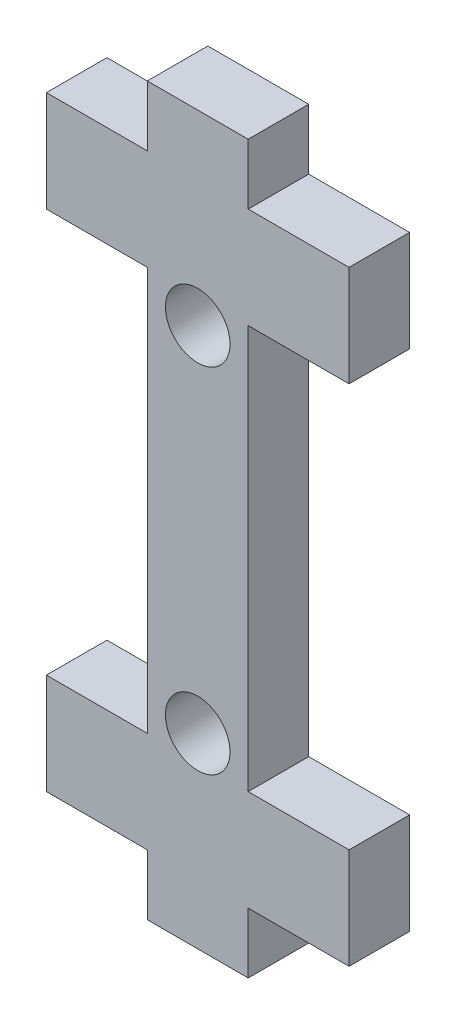
ISO-10303-21;
HEADER;
FILE_DESCRIPTION(('STEP AP214'),'2;1');
FILE_NAME('part.step','',(''),(''),'','','');
FILE_SCHEMA(('AUTOMOTIVE_DESIGN { 1 0 10303 214 1 1 1 1 }'));
ENDSEC;
DATA;
#1=APPLICATION_CONTEXT('core data for automotive mechanical design processes');
#2=APPLICATION_PROTOCOL_DEFINITION('international standard','automotive_design',2000,#1);
#3=PRODUCT_CONTEXT('',#1,'mechanical');
#4=PRODUCT('Part','Part','',(#3));
#5=PRODUCT_RELATED_PRODUCT_CATEGORY('part','',(#4));
#6=PRODUCT_DEFINITION_FORMATION('','',#4);
#7=PRODUCT_DEFINITION_CONTEXT('part definition',#1,'design');
#8=PRODUCT_DEFINITION('design','',#6,#7);
#9=PRODUCT_DEFINITION_SHAPE('','',#8);
#10=(LENGTH_UNIT() NAMED_UNIT(*) SI_UNIT(.MILLI.,.METRE.));
#11=(NAMED_UNIT(*) PLANE_ANGLE_UNIT() SI_UNIT($,.RADIAN.));
#12=(NAMED_UNIT(*) SI_UNIT($,.STERADIAN.) SOLID_ANGLE_UNIT());
#13=UNCERTAINTY_MEASURE_WITH_UNIT(LENGTH_MEASURE(1.E-05),#10,'distance_accuracy_value','');
#14=(GEOMETRIC_REPRESENTATION_CONTEXT(3) GLOBAL_UNCERTAINTY_ASSIGNED_CONTEXT((#13)) GLOBAL_UNIT_ASSIGNED_CONTEXT((#10,
#11,#12)) REPRESENTATION_CONTEXT('',''));
#15=CARTESIAN_POINT('',(0.,0.,0.));
#16=DIRECTION('',(0.,0.,1.));
#17=DIRECTION('',(1.,0.,0.));
#18=AXIS2_PLACEMENT_3D('',#15,#16,#17);
#19=CARTESIAN_POINT('',(0.,0.,3.));
#20=DIRECTION('',(0.,0.,-1.));
#21=DIRECTION('',(-1.,0.,0.));
#22=AXIS2_PLACEMENT_3D('',#19,#20,#21);
#23=PLANE('',#22);
#24=DIRECTION('',(0.,1.,0.));
#25=VECTOR('',#24,1.);
#26=CARTESIAN_POINT('',(2.5,15.,3.));
#27=LINE('',#26,#25);
#28=CARTESIAN_POINT('',(2.5,15.,3.));
#29=VERTEX_POINT('',#28);
#30=CARTESIAN_POINT('',(2.5,18.,3.));
#31=VERTEX_POINT('',#30);
#32=EDGE_CURVE('E272',#29,#31,#27,.T.);
#33=ORIENTED_EDGE('',*,*,#32,.T.);
#34=DIRECTION('',(-1.,0.,0.));
#35=VECTOR('',#34,1.);
#36=CARTESIAN_POINT('',(-2.5,18.,3.));
#37=LINE('',#36,#35);
#38=CARTESIAN_POINT('',(-2.5,18.,3.));
#39=VERTEX_POINT('',#38);
#40=EDGE_CURVE('E136',#31,#39,#37,.T.);
#41=ORIENTED_EDGE('',*,*,#40,.T.);
#42=DIRECTION('',(0.,-1.,0.));
#43=VECTOR('',#42,1.);
#44=CARTESIAN_POINT('',(-2.5,15.,3.));
#45=LINE('',#44,#43);
#46=CARTESIAN_POINT('',(-2.5,15.,3.));
#47=VERTEX_POINT('',#46);
#48=EDGE_CURVE('E341',#39,#47,#45,.T.);
#49=ORIENTED_EDGE('',*,*,#48,.T.);
#50=DIRECTION('',(-1.,0.,0.));
#51=VECTOR('',#50,1.);
#52=CARTESIAN_POINT('',(-7.5,15.,3.));
#53=LINE('',#52,#51);
#54=CARTESIAN_POINT('',(-7.5,15.,3.));
#55=VERTEX_POINT('',#54);
#56=EDGE_CURVE('E361',#47,#55,#53,.T.);
#57=ORIENTED_EDGE('',*,*,#56,.T.);
#58=DIRECTION('',(0.,-1.,0.));
#59=VECTOR('',#58,1.);
#60=CARTESIAN_POINT('',(-7.5,15.,3.));
#61=LINE('',#60,#59);
#62=CARTESIAN_POINT('',(-7.5,10.,3.));
#63=VERTEX_POINT('',#62);
#64=EDGE_CURVE('E357',#55,#63,#61,.T.);
#65=ORIENTED_EDGE('',*,*,#64,.T.);
#66=DIRECTION('',(1.,0.,0.));
#67=VECTOR('',#66,1.);
#68=CARTESIAN_POINT('',(-7.5,10.,3.));
#69=LINE('',#68,#67);
#70=CARTESIAN_POINT('',(-2.5,10.,3.));
#71=VERTEX_POINT('',#70);
#72=EDGE_CURVE('E360',#63,#71,#69,.T.);
#73=ORIENTED_EDGE('',*,*,#72,.T.);
#74=DIRECTION('',(0.,-1.,0.));
#75=VECTOR('',#74,1.);
#76=CARTESIAN_POINT('',(-2.5,-10.,3.));
#77=LINE('',#76,#75);
#78=CARTESIAN_POINT('',(-2.5,-10.,3.));
#79=VERTEX_POINT('',#78);
#80=EDGE_CURVE('E365',#71,#79,#77,.T.);
#81=ORIENTED_EDGE('',*,*,#80,.T.);
#82=DIRECTION('',(-1.,0.,0.));
#83=VECTOR('',#82,1.);
#84=CARTESIAN_POINT('',(-7.5,-10.,3.));
#85=LINE('',#84,#83);
#86=CARTESIAN_POINT('',(-7.5,-10.,3.));
#87=VERTEX_POINT('',#86);
#88=EDGE_CURVE('E372',#79,#87,#85,.T.);
#89=ORIENTED_EDGE('',*,*,#88,.T.);
#90=DIRECTION('',(0.,-1.,0.));
#91=VECTOR('',#90,1.);
#92=CARTESIAN_POINT('',(-7.5,-15.,3.));
#93=LINE('',#92,#91);
#94=CARTESIAN_POINT('',(-7.5,-15.,3.));
#95=VERTEX_POINT('',#94);
#96=EDGE_CURVE('E375',#87,#95,#93,.T.);
#97=ORIENTED_EDGE('',*,*,#96,.T.);
#98=DIRECTION('',(1.,0.,0.));
#99=VECTOR('',#98,1.);
#100=CARTESIAN_POINT('',(-7.5,-15.,3.));
#101=LINE('',#100,#99);
#102=CARTESIAN_POINT('',(-2.5,-15.,3.));
#103=VERTEX_POINT('',#102);
#104=EDGE_CURVE('E378',#95,#103,#101,.T.);
#105=ORIENTED_EDGE('',*,*,#104,.T.);
#106=DIRECTION('',(0.,-1.,0.));
#107=VECTOR('',#106,1.);
#108=CARTESIAN_POINT('',(-2.5,-18.,3.));
#109=LINE('',#108,#107);
#110=CARTESIAN_POINT('',(-2.5,-18.,3.));
#111=VERTEX_POINT('',#110);
#112=EDGE_CURVE('E381',#103,#111,#109,.T.);
#113=ORIENTED_EDGE('',*,*,#112,.T.);
#114=DIRECTION('',(1.,0.,0.));
#115=VECTOR('',#114,1.);
#116=CARTESIAN_POINT('',(-2.5,-18.,3.));
#117=LINE('',#116,#115);
#118=CARTESIAN_POINT('',(2.5,-18.,3.));
#119=VERTEX_POINT('',#118);
#120=EDGE_CURVE('E384',#111,#119,#117,.T.);
#121=ORIENTED_EDGE('',*,*,#120,.T.);
#122=DIRECTION('',(0.,1.,0.));
#123=VECTOR('',#122,1.);
#124=CARTESIAN_POINT('',(2.5,-18.,3.));
#125=LINE('',#124,#123);
#126=CARTESIAN_POINT('',(2.5,-15.,3.));
#127=VERTEX_POINT('',#126);
#128=EDGE_CURVE('E387',#119,#127,#125,.T.);
#129=ORIENTED_EDGE('',*,*,#128,.T.);
#130=DIRECTION('',(1.,0.,0.));
#131=VECTOR('',#130,1.);
#132=CARTESIAN_POINT('',(2.5,-15.,3.));
#133=LINE('',#132,#131);
#134=CARTESIAN_POINT('',(7.5,-15.,3.));
#135=VERTEX_POINT('',#134);
#136=EDGE_CURVE('E390',#127,#135,#133,.T.);
#137=ORIENTED_EDGE('',*,*,#136,.T.);
#138=DIRECTION('',(0.,1.,0.));
#139=VECTOR('',#138,1.);
#140=CARTESIAN_POINT('',(7.5,-15.,3.));
#141=LINE('',#140,#139);
#142=CARTESIAN_POINT('',(7.5,-10.,3.));
#143=VERTEX_POINT('',#142);
#144=EDGE_CURVE('E393',#135,#143,#141,.T.);
#145=ORIENTED_EDGE('',*,*,#144,.T.);
#146=DIRECTION('',(-1.,0.,0.));
#147=VECTOR('',#146,1.);
#148=CARTESIAN_POINT('',(2.5,-10.,3.));
#149=LINE('',#148,#147);
#150=CARTESIAN_POINT('',(2.5,-10.,3.));
#151=VERTEX_POINT('',#150);
#152=EDGE_CURVE('E396',#143,#151,#149,.T.);
#153=ORIENTED_EDGE('',*,*,#152,.T.);
#154=DIRECTION('',(0.,1.,0.));
#155=VECTOR('',#154,1.);
#156=CARTESIAN_POINT('',(2.5,-10.,3.));
#157=LINE('',#156,#155);
#158=CARTESIAN_POINT('',(2.5,10.,3.));
#159=VERTEX_POINT('',#158);
#160=EDGE_CURVE('E191',#151,#159,#157,.T.);
#161=ORIENTED_EDGE('',*,*,#160,.T.);
#162=DIRECTION('',(1.,0.,0.));
#163=VECTOR('',#162,1.);
#164=CARTESIAN_POINT('',(2.5,10.,3.));
#165=LINE('',#164,#163);
#166=CARTESIAN_POINT('',(7.5,10.,3.));
#167=VERTEX_POINT('',#166);
#168=EDGE_CURVE('E185',#159,#167,#165,.T.);
#169=ORIENTED_EDGE('',*,*,#168,.T.);
#170=DIRECTION('',(0.,1.,0.));
#171=VECTOR('',#170,1.);
#172=CARTESIAN_POINT('',(7.5,15.,3.));
#173=LINE('',#172,#171);
#174=CARTESIAN_POINT('',(7.5,15.,3.));
#175=VERTEX_POINT('',#174);
#176=EDGE_CURVE('E189',#167,#175,#173,.T.);
#177=ORIENTED_EDGE('',*,*,#176,.T.);
#178=DIRECTION('',(-1.,0.,0.));
#179=VECTOR('',#178,1.);
#180=CARTESIAN_POINT('',(2.5,15.,3.));
#181=LINE('',#180,#179);
#182=EDGE_CURVE('E57',#175,#29,#181,.T.);
#183=ORIENTED_EDGE('',*,*,#182,.T.);
#184=EDGE_LOOP('',(#33,#41,#49,#57,#65,#73,#81,#89,#97,#105,#113,#121,#129,#137,#145,#153,#161,
#169,#177,#183));
#185=FACE_BOUND('',#184,.T.);
#186=CARTESIAN_POINT('',(0.,8.75,3.));
#187=DIRECTION('',(0.,0.,1.));
#188=DIRECTION('',(1.,0.,0.));
#189=AXIS2_PLACEMENT_3D('',#186,#187,#188);
#190=CIRCLE('',#189,1.6);
#191=CARTESIAN_POINT('',(1.6,8.75,3.));
#192=VERTEX_POINT('',#191);
#193=EDGE_CURVE('E218',#192,#192,#190,.T.);
#194=ORIENTED_EDGE('',*,*,#193,.F.);
#195=EDGE_LOOP('',(#194));
#196=FACE_BOUND('',#195,.T.);
#197=CARTESIAN_POINT('',(0.,-8.75,3.));
#198=DIRECTION('',(0.,0.,1.));
#199=DIRECTION('',(-1.,0.,0.));
#200=AXIS2_PLACEMENT_3D('',#197,#198,#199);
#201=CIRCLE('',#200,1.6);
#202=CARTESIAN_POINT('',(-1.6,-8.75,3.));
#203=VERTEX_POINT('',#202);
#204=EDGE_CURVE('E439',#203,#203,#201,.T.);
#205=ORIENTED_EDGE('',*,*,#204,.F.);
#206=EDGE_LOOP('',(#205));
#207=FACE_BOUND('',#206,.T.);
#208=ADVANCED_FACE('F39',(#185,#196,#207),#23,.F.);
#209=CARTESIAN_POINT('',(0.,0.,0.));
#210=DIRECTION('',(0.,0.,-1.));
#211=DIRECTION('',(-1.,0.,0.));
#212=AXIS2_PLACEMENT_3D('',#209,#210,#211);
#213=PLANE('',#212);
#214=CARTESIAN_POINT('',(0.,8.75,0.));
#215=DIRECTION('',(0.,0.,1.));
#216=DIRECTION('',(1.,0.,0.));
#217=AXIS2_PLACEMENT_3D('',#214,#215,#216);
#218=CIRCLE('',#217,1.6);
#219=CARTESIAN_POINT('',(1.6,8.75,0.));
#220=VERTEX_POINT('',#219);
#221=EDGE_CURVE('E446',#220,#220,#218,.T.);
#222=ORIENTED_EDGE('',*,*,#221,.T.);
#223=EDGE_LOOP('',(#222));
#224=FACE_BOUND('',#223,.T.);
#225=DIRECTION('',(0.,1.,0.));
#226=VECTOR('',#225,1.);
#227=CARTESIAN_POINT('',(2.5,15.,0.));
#228=LINE('',#227,#226);
#229=CARTESIAN_POINT('',(2.5,15.,0.));
#230=VERTEX_POINT('',#229);
#231=CARTESIAN_POINT('',(2.5,18.,0.));
#232=VERTEX_POINT('',#231);
#233=EDGE_CURVE('E213',#230,#232,#228,.T.);
#234=ORIENTED_EDGE('',*,*,#233,.F.);
#235=DIRECTION('',(-1.,0.,0.));
#236=VECTOR('',#235,1.);
#237=CARTESIAN_POINT('',(2.5,15.,0.));
#238=LINE('',#237,#236);
#239=CARTESIAN_POINT('',(7.5,15.,0.));
#240=VERTEX_POINT('',#239);
#241=EDGE_CURVE('E128',#240,#230,#238,.T.);
#242=ORIENTED_EDGE('',*,*,#241,.F.);
#243=DIRECTION('',(0.,1.,0.));
#244=VECTOR('',#243,1.);
#245=CARTESIAN_POINT('',(7.5,15.,0.));
#246=LINE('',#245,#244);
#247=CARTESIAN_POINT('',(7.5,10.,0.));
#248=VERTEX_POINT('',#247);
#249=EDGE_CURVE('E122',#248,#240,#246,.T.);
#250=ORIENTED_EDGE('',*,*,#249,.F.);
#251=DIRECTION('',(1.,0.,0.));
#252=VECTOR('',#251,1.);
#253=CARTESIAN_POINT('',(2.5,10.,0.));
#254=LINE('',#253,#252);
#255=CARTESIAN_POINT('',(2.5,10.,0.));
#256=VERTEX_POINT('',#255);
#257=EDGE_CURVE('E200',#256,#248,#254,.T.);
#258=ORIENTED_EDGE('',*,*,#257,.F.);
#259=DIRECTION('',(0.,1.,0.));
#260=VECTOR('',#259,1.);
#261=CARTESIAN_POINT('',(2.5,-10.,0.));
#262=LINE('',#261,#260);
#263=CARTESIAN_POINT('',(2.5,-10.,0.));
#264=VERTEX_POINT('',#263);
#265=EDGE_CURVE('E263',#264,#256,#262,.T.);
#266=ORIENTED_EDGE('',*,*,#265,.F.);
#267=DIRECTION('',(-1.,0.,0.));
#268=VECTOR('',#267,1.);
#269=CARTESIAN_POINT('',(2.5,-10.,0.));
#270=LINE('',#269,#268);
#271=CARTESIAN_POINT('',(7.5,-10.,0.));
#272=VERTEX_POINT('',#271);
#273=EDGE_CURVE('E260',#272,#264,#270,.T.);
#274=ORIENTED_EDGE('',*,*,#273,.F.);
#275=DIRECTION('',(0.,1.,0.));
#276=VECTOR('',#275,1.);
#277=CARTESIAN_POINT('',(7.5,-15.,0.));
#278=LINE('',#277,#276);
#279=CARTESIAN_POINT('',(7.5,-15.,0.));
#280=VERTEX_POINT('',#279);
#281=EDGE_CURVE('E257',#280,#272,#278,.T.);
#282=ORIENTED_EDGE('',*,*,#281,.F.);
#283=DIRECTION('',(1.,0.,0.));
#284=VECTOR('',#283,1.);
#285=CARTESIAN_POINT('',(2.5,-15.,0.));
#286=LINE('',#285,#284);
#287=CARTESIAN_POINT('',(2.5,-15.,0.));
#288=VERTEX_POINT('',#287);
#289=EDGE_CURVE('E254',#288,#280,#286,.T.);
#290=ORIENTED_EDGE('',*,*,#289,.F.);
#291=DIRECTION('',(0.,1.,0.));
#292=VECTOR('',#291,1.);
#293=CARTESIAN_POINT('',(2.5,-18.,0.));
#294=LINE('',#293,#292);
#295=CARTESIAN_POINT('',(2.5,-18.,0.));
#296=VERTEX_POINT('',#295);
#297=EDGE_CURVE('E251',#296,#288,#294,.T.);
#298=ORIENTED_EDGE('',*,*,#297,.F.);
#299=DIRECTION('',(1.,0.,0.));
#300=VECTOR('',#299,1.);
#301=CARTESIAN_POINT('',(-2.5,-18.,0.));
#302=LINE('',#301,#300);
#303=CARTESIAN_POINT('',(-2.5,-18.,0.));
#304=VERTEX_POINT('',#303);
#305=EDGE_CURVE('E248',#304,#296,#302,.T.);
#306=ORIENTED_EDGE('',*,*,#305,.F.);
#307=DIRECTION('',(0.,-1.,0.));
#308=VECTOR('',#307,1.);
#309=CARTESIAN_POINT('',(-2.5,-18.,0.));
#310=LINE('',#309,#308);
#311=CARTESIAN_POINT('',(-2.5,-15.,0.));
#312=VERTEX_POINT('',#311);
#313=EDGE_CURVE('E245',#312,#304,#310,.T.);
#314=ORIENTED_EDGE('',*,*,#313,.F.);
#315=DIRECTION('',(1.,0.,0.));
#316=VECTOR('',#315,1.);
#317=CARTESIAN_POINT('',(-7.5,-15.,0.));
#318=LINE('',#317,#316);
#319=CARTESIAN_POINT('',(-7.5,-15.,0.));
#320=VERTEX_POINT('',#319);
#321=EDGE_CURVE('E242',#320,#312,#318,.T.);
#322=ORIENTED_EDGE('',*,*,#321,.F.);
#323=DIRECTION('',(0.,-1.,0.));
#324=VECTOR('',#323,1.);
#325=CARTESIAN_POINT('',(-7.5,-15.,0.));
#326=LINE('',#325,#324);
#327=CARTESIAN_POINT('',(-7.5,-10.,0.));
#328=VERTEX_POINT('',#327);
#329=EDGE_CURVE('E239',#328,#320,#326,.T.);
#330=ORIENTED_EDGE('',*,*,#329,.F.);
#331=DIRECTION('',(-1.,0.,0.));
#332=VECTOR('',#331,1.);
#333=CARTESIAN_POINT('',(-7.5,-10.,0.));
#334=LINE('',#333,#332);
#335=CARTESIAN_POINT('',(-2.5,-10.,0.));
#336=VERTEX_POINT('',#335);
#337=EDGE_CURVE('E236',#336,#328,#334,.T.);
#338=ORIENTED_EDGE('',*,*,#337,.F.);
#339=DIRECTION('',(0.,-1.,0.));
#340=VECTOR('',#339,1.);
#341=CARTESIAN_POINT('',(-2.5,-10.,0.));
#342=LINE('',#341,#340);
#343=CARTESIAN_POINT('',(-2.5,10.,0.));
#344=VERTEX_POINT('',#343);
#345=EDGE_CURVE('E233',#344,#336,#342,.T.);
#346=ORIENTED_EDGE('',*,*,#345,.F.);
#347=DIRECTION('',(1.,0.,0.));
#348=VECTOR('',#347,1.);
#349=CARTESIAN_POINT('',(-7.5,10.,0.));
#350=LINE('',#349,#348);
#351=CARTESIAN_POINT('',(-7.5,10.,0.));
#352=VERTEX_POINT('',#351);
#353=EDGE_CURVE('E230',#352,#344,#350,.T.);
#354=ORIENTED_EDGE('',*,*,#353,.F.);
#355=DIRECTION('',(0.,-1.,0.));
#356=VECTOR('',#355,1.);
#357=CARTESIAN_POINT('',(-7.5,15.,0.));
#358=LINE('',#357,#356);
#359=CARTESIAN_POINT('',(-7.5,15.,0.));
#360=VERTEX_POINT('',#359);
#361=EDGE_CURVE('E227',#360,#352,#358,.T.);
#362=ORIENTED_EDGE('',*,*,#361,.F.);
#363=DIRECTION('',(-1.,0.,0.));
#364=VECTOR('',#363,1.);
#365=CARTESIAN_POINT('',(-7.5,15.,0.));
#366=LINE('',#365,#364);
#367=CARTESIAN_POINT('',(-2.5,15.,0.));
#368=VERTEX_POINT('',#367);
#369=EDGE_CURVE('E224',#368,#360,#366,.T.);
#370=ORIENTED_EDGE('',*,*,#369,.F.);
#371=DIRECTION('',(0.,-1.,0.));
#372=VECTOR('',#371,1.);
#373=CARTESIAN_POINT('',(-2.5,15.,0.));
#374=LINE('',#373,#372);
#375=CARTESIAN_POINT('',(-2.5,18.,0.));
#376=VERTEX_POINT('',#375);
#377=EDGE_CURVE('E221',#376,#368,#374,.T.);
#378=ORIENTED_EDGE('',*,*,#377,.F.);
#379=DIRECTION('',(-1.,0.,0.));
#380=VECTOR('',#379,1.);
#381=CARTESIAN_POINT('',(-2.5,18.,0.));
#382=LINE('',#381,#380);
#383=EDGE_CURVE('E217',#232,#376,#382,.T.);
#384=ORIENTED_EDGE('',*,*,#383,.F.);
#385=EDGE_LOOP('',(#234,#242,#250,#258,#266,#274,#282,#290,#298,#306,#314,#322,#330,#338,#346,
#354,#362,#370,#378,#384));
#386=FACE_BOUND('',#385,.T.);
#387=CARTESIAN_POINT('',(0.,-8.75,0.));
#388=DIRECTION('',(0.,0.,1.));
#389=DIRECTION('',(-1.,0.,0.));
#390=AXIS2_PLACEMENT_3D('',#387,#388,#389);
#391=CIRCLE('',#390,1.6);
#392=CARTESIAN_POINT('',(-1.6,-8.75,0.));
#393=VERTEX_POINT('',#392);
#394=EDGE_CURVE('E442',#393,#393,#391,.T.);
#395=ORIENTED_EDGE('',*,*,#394,.T.);
#396=EDGE_LOOP('',(#395));
#397=FACE_BOUND('',#396,.T.);
#398=ADVANCED_FACE('F345',(#224,#386,#397),#213,.T.);
#399=CARTESIAN_POINT('',(2.5,15.,3.));
#400=DIRECTION('',(-1.,0.,0.));
#401=DIRECTION('',(0.,-1.,0.));
#402=AXIS2_PLACEMENT_3D('',#399,#400,#401);
#403=PLANE('',#402);
#404=ORIENTED_EDGE('',*,*,#233,.T.);
#405=DIRECTION('',(0.,0.,-1.));
#406=VECTOR('',#405,1.);
#407=CARTESIAN_POINT('',(2.5,18.,3.));
#408=LINE('',#407,#406);
#409=EDGE_CURVE('E11',#31,#232,#408,.T.);
#410=ORIENTED_EDGE('',*,*,#409,.F.);
#411=ORIENTED_EDGE('',*,*,#32,.F.);
#412=DIRECTION('',(0.,0.,-1.));
#413=VECTOR('',#412,1.);
#414=CARTESIAN_POINT('',(2.5,15.,3.));
#415=LINE('',#414,#413);
#416=EDGE_CURVE('E209',#29,#230,#415,.T.);
#417=ORIENTED_EDGE('',*,*,#416,.T.);
#418=EDGE_LOOP('',(#404,#410,#411,#417));
#419=FACE_BOUND('',#418,.T.);
#420=ADVANCED_FACE('F41',(#419),#403,.F.);
#421=CARTESIAN_POINT('',(-2.5,18.,3.));
#422=DIRECTION('',(0.,-1.,0.));
#423=DIRECTION('',(0.,0.,-1.));
#424=AXIS2_PLACEMENT_3D('',#421,#422,#423);
#425=PLANE('',#424);
#426=ORIENTED_EDGE('',*,*,#383,.T.);
#427=DIRECTION('',(0.,0.,-1.));
#428=VECTOR('',#427,1.);
#429=CARTESIAN_POINT('',(-2.5,18.,3.));
#430=LINE('',#429,#428);
#431=EDGE_CURVE('E49',#39,#376,#430,.T.);
#432=ORIENTED_EDGE('',*,*,#431,.F.);
#433=ORIENTED_EDGE('',*,*,#40,.F.);
#434=ORIENTED_EDGE('',*,*,#409,.T.);
#435=EDGE_LOOP('',(#426,#432,#433,#434));
#436=FACE_BOUND('',#435,.T.);
#437=ADVANCED_FACE('F626',(#436),#425,.F.);
#438=CARTESIAN_POINT('',(-2.5,15.,3.));
#439=DIRECTION('',(1.,0.,0.));
#440=DIRECTION('',(0.,1.,0.));
#441=AXIS2_PLACEMENT_3D('',#438,#439,#440);
#442=PLANE('',#441);
#443=ORIENTED_EDGE('',*,*,#377,.T.);
#444=DIRECTION('',(0.,0.,-1.));
#445=VECTOR('',#444,1.);
#446=CARTESIAN_POINT('',(-2.5,15.,3.));
#447=LINE('',#446,#445);
#448=EDGE_CURVE('E331',#47,#368,#447,.T.);
#449=ORIENTED_EDGE('',*,*,#448,.F.);
#450=ORIENTED_EDGE('',*,*,#48,.F.);
#451=ORIENTED_EDGE('',*,*,#431,.T.);
#452=EDGE_LOOP('',(#443,#449,#450,#451));
#453=FACE_BOUND('',#452,.T.);
#454=ADVANCED_FACE('F339',(#453),#442,.F.);
#455=CARTESIAN_POINT('',(-7.5,15.,3.));
#456=DIRECTION('',(0.,-1.,0.));
#457=DIRECTION('',(1.,0.,0.));
#458=AXIS2_PLACEMENT_3D('',#455,#456,#457);
#459=PLANE('',#458);
#460=ORIENTED_EDGE('',*,*,#369,.T.);
#461=DIRECTION('',(0.,0.,-1.));
#462=VECTOR('',#461,1.);
#463=CARTESIAN_POINT('',(-7.5,15.,3.));
#464=LINE('',#463,#462);
#465=EDGE_CURVE('E327',#55,#360,#464,.T.);
#466=ORIENTED_EDGE('',*,*,#465,.F.);
#467=ORIENTED_EDGE('',*,*,#56,.F.);
#468=ORIENTED_EDGE('',*,*,#448,.T.);
#469=EDGE_LOOP('',(#460,#466,#467,#468));
#470=FACE_BOUND('',#469,.T.);
#471=ADVANCED_FACE('F351',(#470),#459,.F.);
#472=CARTESIAN_POINT('',(-7.5,15.,3.));
#473=DIRECTION('',(1.,0.,0.));
#474=DIRECTION('',(0.,1.,0.));
#475=AXIS2_PLACEMENT_3D('',#472,#473,#474);
#476=PLANE('',#475);
#477=ORIENTED_EDGE('',*,*,#361,.T.);
#478=DIRECTION('',(0.,0.,-1.));
#479=VECTOR('',#478,1.);
#480=CARTESIAN_POINT('',(-7.5,10.,3.));
#481=LINE('',#480,#479);
#482=EDGE_CURVE('E323',#63,#352,#481,.T.);
#483=ORIENTED_EDGE('',*,*,#482,.F.);
#484=ORIENTED_EDGE('',*,*,#64,.F.);
#485=ORIENTED_EDGE('',*,*,#465,.T.);
#486=EDGE_LOOP('',(#477,#483,#484,#485));
#487=FACE_BOUND('',#486,.T.);
#488=ADVANCED_FACE('F355',(#487),#476,.F.);
#489=CARTESIAN_POINT('',(-7.5,10.,3.));
#490=DIRECTION('',(0.,1.,0.));
#491=DIRECTION('',(0.,0.,1.));
#492=AXIS2_PLACEMENT_3D('',#489,#490,#491);
#493=PLANE('',#492);
#494=ORIENTED_EDGE('',*,*,#353,.T.);
#495=DIRECTION('',(0.,0.,-1.));
#496=VECTOR('',#495,1.);
#497=CARTESIAN_POINT('',(-2.5,10.,3.));
#498=LINE('',#497,#496);
#499=EDGE_CURVE('E319',#71,#344,#498,.T.);
#500=ORIENTED_EDGE('',*,*,#499,.F.);
#501=ORIENTED_EDGE('',*,*,#72,.F.);
#502=ORIENTED_EDGE('',*,*,#482,.T.);
#503=EDGE_LOOP('',(#494,#500,#501,#502));
#504=FACE_BOUND('',#503,.T.);
#505=ADVANCED_FACE('F591',(#504),#493,.F.);
#506=CARTESIAN_POINT('',(-2.5,-10.,3.));
#507=DIRECTION('',(1.,0.,0.));
#508=DIRECTION('',(0.,0.,-1.));
#509=AXIS2_PLACEMENT_3D('',#506,#507,#508);
#510=PLANE('',#509);
#511=ORIENTED_EDGE('',*,*,#345,.T.);
#512=DIRECTION('',(0.,0.,-1.));
#513=VECTOR('',#512,1.);
#514=CARTESIAN_POINT('',(-2.5,-10.,3.));
#515=LINE('',#514,#513);
#516=EDGE_CURVE('E315',#79,#336,#515,.T.);
#517=ORIENTED_EDGE('',*,*,#516,.F.);
#518=ORIENTED_EDGE('',*,*,#80,.F.);
#519=ORIENTED_EDGE('',*,*,#499,.T.);
#520=EDGE_LOOP('',(#511,#517,#518,#519));
#521=FACE_BOUND('',#520,.T.);
#522=ADVANCED_FACE('F581',(#521),#510,.F.);
#523=CARTESIAN_POINT('',(-7.5,-10.,3.));
#524=DIRECTION('',(0.,-1.,0.));
#525=DIRECTION('',(0.,0.,-1.));
#526=AXIS2_PLACEMENT_3D('',#523,#524,#525);
#527=PLANE('',#526);
#528=ORIENTED_EDGE('',*,*,#337,.T.);
#529=DIRECTION('',(0.,0.,-1.));
#530=VECTOR('',#529,1.);
#531=CARTESIAN_POINT('',(-7.5,-10.,3.));
#532=LINE('',#531,#530);
#533=EDGE_CURVE('E311',#87,#328,#532,.T.);
#534=ORIENTED_EDGE('',*,*,#533,.F.);
#535=ORIENTED_EDGE('',*,*,#88,.F.);
#536=ORIENTED_EDGE('',*,*,#516,.T.);
#537=EDGE_LOOP('',(#528,#534,#535,#536));
#538=FACE_BOUND('',#537,.T.);
#539=ADVANCED_FACE('F571',(#538),#527,.F.);
#540=CARTESIAN_POINT('',(-7.5,-15.,3.));
#541=DIRECTION('',(1.,0.,0.));
#542=DIRECTION('',(0.,1.,0.));
#543=AXIS2_PLACEMENT_3D('',#540,#541,#542);
#544=PLANE('',#543);
#545=ORIENTED_EDGE('',*,*,#329,.T.);
#546=DIRECTION('',(0.,0.,-1.));
#547=VECTOR('',#546,1.);
#548=CARTESIAN_POINT('',(-7.5,-15.,3.));
#549=LINE('',#548,#547);
#550=EDGE_CURVE('E307',#95,#320,#549,.T.);
#551=ORIENTED_EDGE('',*,*,#550,.F.);
#552=ORIENTED_EDGE('',*,*,#96,.F.);
#553=ORIENTED_EDGE('',*,*,#533,.T.);
#554=EDGE_LOOP('',(#545,#551,#552,#553));
#555=FACE_BOUND('',#554,.T.);
#556=ADVANCED_FACE('F561',(#555),#544,.F.);
#557=CARTESIAN_POINT('',(-7.5,-15.,3.));
#558=DIRECTION('',(0.,1.,0.));
#559=DIRECTION('',(-1.,0.,0.));
#560=AXIS2_PLACEMENT_3D('',#557,#558,#559);
#561=PLANE('',#560);
#562=ORIENTED_EDGE('',*,*,#321,.T.);
#563=DIRECTION('',(0.,0.,-1.));
#564=VECTOR('',#563,1.);
#565=CARTESIAN_POINT('',(-2.5,-15.,3.));
#566=LINE('',#565,#564);
#567=EDGE_CURVE('E303',#103,#312,#566,.T.);
#568=ORIENTED_EDGE('',*,*,#567,.F.);
#569=ORIENTED_EDGE('',*,*,#104,.F.);
#570=ORIENTED_EDGE('',*,*,#550,.T.);
#571=EDGE_LOOP('',(#562,#568,#569,#570));
#572=FACE_BOUND('',#571,.T.);
#573=ADVANCED_FACE('F551',(#572),#561,.F.);
#574=CARTESIAN_POINT('',(-2.5,-18.,3.));
#575=DIRECTION('',(1.,0.,0.));
#576=DIRECTION('',(0.,1.,0.));
#577=AXIS2_PLACEMENT_3D('',#574,#575,#576);
#578=PLANE('',#577);
#579=ORIENTED_EDGE('',*,*,#313,.T.);
#580=DIRECTION('',(0.,0.,-1.));
#581=VECTOR('',#580,1.);
#582=CARTESIAN_POINT('',(-2.5,-18.,3.));
#583=LINE('',#582,#581);
#584=EDGE_CURVE('E299',#111,#304,#583,.T.);
#585=ORIENTED_EDGE('',*,*,#584,.F.);
#586=ORIENTED_EDGE('',*,*,#112,.F.);
#587=ORIENTED_EDGE('',*,*,#567,.T.);
#588=EDGE_LOOP('',(#579,#585,#586,#587));
#589=FACE_BOUND('',#588,.T.);
#590=ADVANCED_FACE('F541',(#589),#578,.F.);
#591=CARTESIAN_POINT('',(-2.5,-18.,3.));
#592=DIRECTION('',(0.,1.,0.));
#593=DIRECTION('',(0.,0.,1.));
#594=AXIS2_PLACEMENT_3D('',#591,#592,#593);
#595=PLANE('',#594);
#596=ORIENTED_EDGE('',*,*,#305,.T.);
#597=DIRECTION('',(0.,0.,-1.));
#598=VECTOR('',#597,1.);
#599=CARTESIAN_POINT('',(2.5,-18.,3.));
#600=LINE('',#599,#598);
#601=EDGE_CURVE('E295',#119,#296,#600,.T.);
#602=ORIENTED_EDGE('',*,*,#601,.F.);
#603=ORIENTED_EDGE('',*,*,#120,.F.);
#604=ORIENTED_EDGE('',*,*,#584,.T.);
#605=EDGE_LOOP('',(#596,#602,#603,#604));
#606=FACE_BOUND('',#605,.T.);
#607=ADVANCED_FACE('F531',(#606),#595,.F.);
#608=CARTESIAN_POINT('',(2.5,-18.,3.));
#609=DIRECTION('',(-1.,0.,0.));
#610=DIRECTION('',(0.,-1.,0.));
#611=AXIS2_PLACEMENT_3D('',#608,#609,#610);
#612=PLANE('',#611);
#613=ORIENTED_EDGE('',*,*,#297,.T.);
#614=DIRECTION('',(0.,0.,-1.));
#615=VECTOR('',#614,1.);
#616=CARTESIAN_POINT('',(2.5,-15.,3.));
#617=LINE('',#616,#615);
#618=EDGE_CURVE('E291',#127,#288,#617,.T.);
#619=ORIENTED_EDGE('',*,*,#618,.F.);
#620=ORIENTED_EDGE('',*,*,#128,.F.);
#621=ORIENTED_EDGE('',*,*,#601,.T.);
#622=EDGE_LOOP('',(#613,#619,#620,#621));
#623=FACE_BOUND('',#622,.T.);
#624=ADVANCED_FACE('F521',(#623),#612,.F.);
#625=CARTESIAN_POINT('',(2.5,-15.,3.));
#626=DIRECTION('',(0.,1.,0.));
#627=DIRECTION('',(0.,0.,1.));
#628=AXIS2_PLACEMENT_3D('',#625,#626,#627);
#629=PLANE('',#628);
#630=ORIENTED_EDGE('',*,*,#289,.T.);
#631=DIRECTION('',(0.,0.,-1.));
#632=VECTOR('',#631,1.);
#633=CARTESIAN_POINT('',(7.5,-15.,3.));
#634=LINE('',#633,#632);
#635=EDGE_CURVE('E287',#135,#280,#634,.T.);
#636=ORIENTED_EDGE('',*,*,#635,.F.);
#637=ORIENTED_EDGE('',*,*,#136,.F.);
#638=ORIENTED_EDGE('',*,*,#618,.T.);
#639=EDGE_LOOP('',(#630,#636,#637,#638));
#640=FACE_BOUND('',#639,.T.);
#641=ADVANCED_FACE('F511',(#640),#629,.F.);
#642=CARTESIAN_POINT('',(7.5,-15.,3.));
#643=DIRECTION('',(-1.,0.,0.));
#644=DIRECTION('',(0.,-1.,0.));
#645=AXIS2_PLACEMENT_3D('',#642,#643,#644);
#646=PLANE('',#645);
#647=ORIENTED_EDGE('',*,*,#281,.T.);
#648=DIRECTION('',(0.,0.,-1.));
#649=VECTOR('',#648,1.);
#650=CARTESIAN_POINT('',(7.5,-10.,3.));
#651=LINE('',#650,#649);
#652=EDGE_CURVE('E283',#143,#272,#651,.T.);
#653=ORIENTED_EDGE('',*,*,#652,.F.);
#654=ORIENTED_EDGE('',*,*,#144,.F.);
#655=ORIENTED_EDGE('',*,*,#635,.T.);
#656=EDGE_LOOP('',(#647,#653,#654,#655));
#657=FACE_BOUND('',#656,.T.);
#658=ADVANCED_FACE('F502',(#657),#646,.F.);
#659=CARTESIAN_POINT('',(2.5,-10.,3.));
#660=DIRECTION('',(0.,-1.,0.));
#661=DIRECTION('',(0.,0.,-1.));
#662=AXIS2_PLACEMENT_3D('',#659,#660,#661);
#663=PLANE('',#662);
#664=ORIENTED_EDGE('',*,*,#273,.T.);
#665=DIRECTION('',(0.,0.,-1.));
#666=VECTOR('',#665,1.);
#667=CARTESIAN_POINT('',(2.5,-10.,3.));
#668=LINE('',#667,#666);
#669=EDGE_CURVE('E279',#151,#264,#668,.T.);
#670=ORIENTED_EDGE('',*,*,#669,.F.);
#671=ORIENTED_EDGE('',*,*,#152,.F.);
#672=ORIENTED_EDGE('',*,*,#652,.T.);
#673=EDGE_LOOP('',(#664,#670,#671,#672));
#674=FACE_BOUND('',#673,.T.);
#675=ADVANCED_FACE('F404',(#674),#663,.F.);
#676=CARTESIAN_POINT('',(2.5,-10.,3.));
#677=DIRECTION('',(-1.,0.,0.));
#678=DIRECTION('',(0.,0.,1.));
#679=AXIS2_PLACEMENT_3D('',#676,#677,#678);
#680=PLANE('',#679);
#681=ORIENTED_EDGE('',*,*,#265,.T.);
#682=DIRECTION('',(0.,0.,-1.));
#683=VECTOR('',#682,1.);
#684=CARTESIAN_POINT('',(2.5,10.,3.));
#685=LINE('',#684,#683);
#686=EDGE_CURVE('E202',#159,#256,#685,.T.);
#687=ORIENTED_EDGE('',*,*,#686,.F.);
#688=ORIENTED_EDGE('',*,*,#160,.F.);
#689=ORIENTED_EDGE('',*,*,#669,.T.);
#690=EDGE_LOOP('',(#681,#687,#688,#689));
#691=FACE_BOUND('',#690,.T.);
#692=ADVANCED_FACE('F408',(#691),#680,.F.);
#693=CARTESIAN_POINT('',(2.5,10.,3.));
#694=DIRECTION('',(0.,1.,0.));
#695=DIRECTION('',(0.,0.,1.));
#696=AXIS2_PLACEMENT_3D('',#693,#694,#695);
#697=PLANE('',#696);
#698=ORIENTED_EDGE('',*,*,#257,.T.);
#699=DIRECTION('',(0.,0.,-1.));
#700=VECTOR('',#699,1.);
#701=CARTESIAN_POINT('',(7.5,10.,3.));
#702=LINE('',#701,#700);
#703=EDGE_CURVE('E197',#167,#248,#702,.T.);
#704=ORIENTED_EDGE('',*,*,#703,.F.);
#705=ORIENTED_EDGE('',*,*,#168,.F.);
#706=ORIENTED_EDGE('',*,*,#686,.T.);
#707=EDGE_LOOP('',(#698,#704,#705,#706));
#708=FACE_BOUND('',#707,.T.);
#709=ADVANCED_FACE('F198',(#708),#697,.F.);
#710=CARTESIAN_POINT('',(7.5,15.,3.));
#711=DIRECTION('',(-1.,0.,0.));
#712=DIRECTION('',(0.,-1.,0.));
#713=AXIS2_PLACEMENT_3D('',#710,#711,#712);
#714=PLANE('',#713);
#715=ORIENTED_EDGE('',*,*,#249,.T.);
#716=DIRECTION('',(0.,0.,-1.));
#717=VECTOR('',#716,1.);
#718=CARTESIAN_POINT('',(7.5,15.,3.));
#719=LINE('',#718,#717);
#720=EDGE_CURVE('E203',#175,#240,#719,.T.);
#721=ORIENTED_EDGE('',*,*,#720,.F.);
#722=ORIENTED_EDGE('',*,*,#176,.F.);
#723=ORIENTED_EDGE('',*,*,#703,.T.);
#724=EDGE_LOOP('',(#715,#721,#722,#723));
#725=FACE_BOUND('',#724,.T.);
#726=ADVANCED_FACE('F205',(#725),#714,.F.);
#727=CARTESIAN_POINT('',(2.5,15.,3.));
#728=DIRECTION('',(0.,-1.,0.));
#729=DIRECTION('',(0.,0.,-1.));
#730=AXIS2_PLACEMENT_3D('',#727,#728,#729);
#731=PLANE('',#730);
#732=ORIENTED_EDGE('',*,*,#241,.T.);
#733=ORIENTED_EDGE('',*,*,#416,.F.);
#734=ORIENTED_EDGE('',*,*,#182,.F.);
#735=ORIENTED_EDGE('',*,*,#720,.T.);
#736=EDGE_LOOP('',(#732,#733,#734,#735));
#737=FACE_BOUND('',#736,.T.);
#738=ADVANCED_FACE('F412',(#737),#731,.F.);
#739=CARTESIAN_POINT('',(0.,8.75,3.));
#740=DIRECTION('',(0.,0.,-1.));
#741=DIRECTION('',(-1.,0.,0.));
#742=AXIS2_PLACEMENT_3D('',#739,#740,#741);
#743=CYLINDRICAL_SURFACE('',#742,1.6);
#744=ORIENTED_EDGE('',*,*,#193,.T.);
#745=EDGE_LOOP('',(#744));
#746=FACE_BOUND('',#745,.T.);
#747=ORIENTED_EDGE('',*,*,#221,.F.);
#748=EDGE_LOOP('',(#747));
#749=FACE_BOUND('',#748,.T.);
#750=ADVANCED_FACE('F414',(#746,#749),#743,.F.);
#751=CARTESIAN_POINT('',(0.,-8.75,3.));
#752=DIRECTION('',(0.,0.,-1.));
#753=DIRECTION('',(-1.,0.,0.));
#754=AXIS2_PLACEMENT_3D('',#751,#752,#753);
#755=CYLINDRICAL_SURFACE('',#754,1.6);
#756=ORIENTED_EDGE('',*,*,#204,.T.);
#757=EDGE_LOOP('',(#756));
#758=FACE_BOUND('',#757,.T.);
#759=ORIENTED_EDGE('',*,*,#394,.F.);
#760=EDGE_LOOP('',(#759));
#761=FACE_BOUND('',#760,.T.);
#762=ADVANCED_FACE('F420',(#758,#761),#755,.F.);
#763=CLOSED_SHELL('',(#208,#398,#420,#437,#454,#471,#488,#505,#522,#539,#556,#573,#590,#607,
#624,#641,#658,#675,#692,#709,#726,#738,#750,#762));
#764=MANIFOLD_SOLID_BREP('B2',#763);
#765=ADVANCED_BREP_SHAPE_REPRESENTATION('',(#18,#764),#14);
#766=SHAPE_DEFINITION_REPRESENTATION(#9,#765);
ENDSEC;
END-ISO-10303-21;
